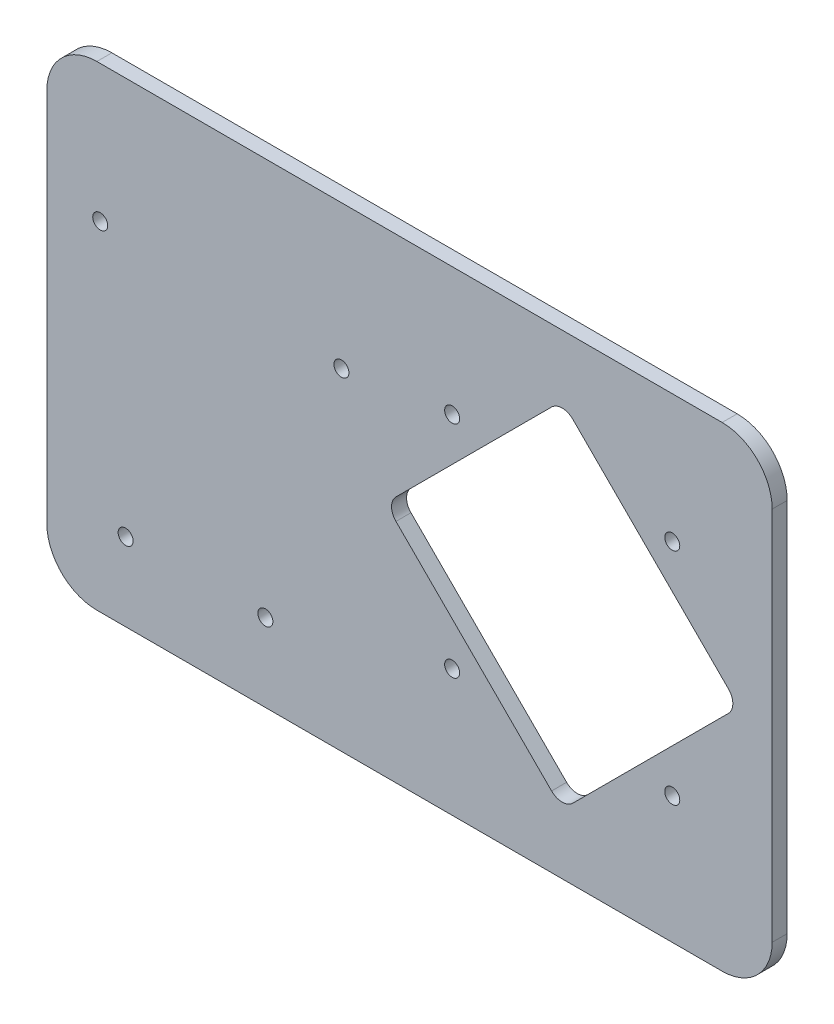
ISO-10303-21;
HEADER;
FILE_DESCRIPTION(('STEP AP214'),'2;1');
FILE_NAME('part.step','',(''),(''),'','','');
FILE_SCHEMA(('AUTOMOTIVE_DESIGN { 1 0 10303 214 1 1 1 1 }'));
ENDSEC;
DATA;
#1=APPLICATION_CONTEXT('core data for automotive mechanical design processes');
#2=APPLICATION_PROTOCOL_DEFINITION('international standard','automotive_design',2000,#1);
#3=PRODUCT_CONTEXT('',#1,'mechanical');
#4=PRODUCT('Part','Part','',(#3));
#5=PRODUCT_RELATED_PRODUCT_CATEGORY('part','',(#4));
#6=PRODUCT_DEFINITION_FORMATION('','',#4);
#7=PRODUCT_DEFINITION_CONTEXT('part definition',#1,'design');
#8=PRODUCT_DEFINITION('design','',#6,#7);
#9=PRODUCT_DEFINITION_SHAPE('','',#8);
#10=(LENGTH_UNIT() NAMED_UNIT(*) SI_UNIT(.MILLI.,.METRE.));
#11=(NAMED_UNIT(*) PLANE_ANGLE_UNIT() SI_UNIT($,.RADIAN.));
#12=(NAMED_UNIT(*) SI_UNIT($,.STERADIAN.) SOLID_ANGLE_UNIT());
#13=UNCERTAINTY_MEASURE_WITH_UNIT(LENGTH_MEASURE(1.E-05),#10,'distance_accuracy_value','');
#14=(GEOMETRIC_REPRESENTATION_CONTEXT(3) GLOBAL_UNCERTAINTY_ASSIGNED_CONTEXT((#13)) GLOBAL_UNIT_ASSIGNED_CONTEXT((#10,
#11,#12)) REPRESENTATION_CONTEXT('',''));
#15=CARTESIAN_POINT('',(0.,0.,0.));
#16=DIRECTION('',(0.,0.,1.));
#17=DIRECTION('',(1.,0.,0.));
#18=AXIS2_PLACEMENT_3D('',#15,#16,#17);
#19=CARTESIAN_POINT('',(210.81212736023,-100.397544227628,3.));
#20=DIRECTION('',(0.,0.,-1.));
#21=DIRECTION('',(-1.,0.,0.));
#22=AXIS2_PLACEMENT_3D('',#19,#20,#21);
#23=PLANE('',#22);
#24=CARTESIAN_POINT('',(119.499920391212,-94.8142449071614,3.));
#25=DIRECTION('',(0.,0.,1.));
#26=DIRECTION('',(1.,0.,0.));
#27=AXIS2_PLACEMENT_3D('',#24,#25,#26);
#28=CIRCLE('',#27,1.5);
#29=CARTESIAN_POINT('',(120.999920391212,-94.8142449071614,3.));
#30=VERTEX_POINT('',#29);
#31=EDGE_CURVE('E389',#30,#30,#28,.T.);
#32=ORIENTED_EDGE('',*,*,#31,.F.);
#33=EDGE_LOOP('',(#32));
#34=FACE_BOUND('',#33,.T.);
#35=CARTESIAN_POINT('',(86.4844395206436,-42.7442449071614,3.));
#36=DIRECTION('',(0.,0.,1.));
#37=DIRECTION('',(1.,0.,0.));
#38=AXIS2_PLACEMENT_3D('',#35,#36,#37);
#39=CIRCLE('',#38,1.5);
#40=CARTESIAN_POINT('',(87.9844395206436,-42.7442449071614,3.));
#41=VERTEX_POINT('',#40);
#42=EDGE_CURVE('E188',#41,#41,#39,.T.);
#43=ORIENTED_EDGE('',*,*,#42,.F.);
#44=EDGE_LOOP('',(#43));
#45=FACE_BOUND('',#44,.T.);
#46=CARTESIAN_POINT('',(200.841254595853,-85.0080740411857,3.));
#47=DIRECTION('',(0.,0.,1.));
#48=DIRECTION('',(1.,0.,0.));
#49=AXIS2_PLACEMENT_3D('',#46,#47,#48);
#50=CIRCLE('',#49,1.49999999999949);
#51=CARTESIAN_POINT('',(202.341254595852,-85.0080740411857,3.));
#52=VERTEX_POINT('',#51);
#53=EDGE_CURVE('E218',#52,#52,#50,.T.);
#54=ORIENTED_EDGE('',*,*,#53,.F.);
#55=EDGE_LOOP('',(#54));
#56=FACE_BOUND('',#55,.T.);
#57=CARTESIAN_POINT('',(156.837999602614,-41.004819047947,3.));
#58=DIRECTION('',(0.,0.,1.));
#59=DIRECTION('',(1.,0.,0.));
#60=AXIS2_PLACEMENT_3D('',#57,#58,#59);
#61=CIRCLE('',#60,1.49999999999937);
#62=CARTESIAN_POINT('',(158.337999602613,-41.004819047947,3.));
#63=VERTEX_POINT('',#62);
#64=EDGE_CURVE('E230',#63,#63,#61,.T.);
#65=ORIENTED_EDGE('',*,*,#64,.F.);
#66=EDGE_LOOP('',(#65));
#67=FACE_BOUND('',#66,.T.);
#68=CARTESIAN_POINT('',(210.81212736023,-100.397544227628,3.));
#69=DIRECTION('',(0.,0.,1.));
#70=DIRECTION('',(-1.,0.,0.));
#71=AXIS2_PLACEMENT_3D('',#68,#69,#70);
#72=CIRCLE('',#71,9.99999999999999);
#73=CARTESIAN_POINT('',(210.81212736023,-110.397544227628,3.));
#74=VERTEX_POINT('',#73);
#75=CARTESIAN_POINT('',(220.81212736023,-100.397544227628,3.));
#76=VERTEX_POINT('',#75);
#77=EDGE_CURVE('E242',#74,#76,#72,.T.);
#78=ORIENTED_EDGE('',*,*,#77,.T.);
#79=DIRECTION('',(0.,1.,0.));
#80=VECTOR('',#79,1.);
#81=CARTESIAN_POINT('',(220.81212736023,-25.3975442276282,3.));
#82=LINE('',#81,#80);
#83=CARTESIAN_POINT('',(220.81212736023,-25.3975442276282,3.));
#84=VERTEX_POINT('',#83);
#85=EDGE_CURVE('E245',#76,#84,#82,.T.);
#86=ORIENTED_EDGE('',*,*,#85,.T.);
#87=CARTESIAN_POINT('',(210.81212736023,-25.3975442276282,3.));
#88=DIRECTION('',(0.,0.,1.));
#89=DIRECTION('',(-1.,0.,0.));
#90=AXIS2_PLACEMENT_3D('',#87,#88,#89);
#91=CIRCLE('',#90,10.);
#92=CARTESIAN_POINT('',(210.81212736023,-15.3975442276282,3.));
#93=VERTEX_POINT('',#92);
#94=EDGE_CURVE('E248',#84,#93,#91,.T.);
#95=ORIENTED_EDGE('',*,*,#94,.T.);
#96=DIRECTION('',(-1.,0.,0.));
#97=VECTOR('',#96,1.);
#98=CARTESIAN_POINT('',(210.81212736023,-15.3975442276282,3.));
#99=LINE('',#98,#97);
#100=CARTESIAN_POINT('',(85.8121273602302,-15.3975442276282,3.));
#101=VERTEX_POINT('',#100);
#102=EDGE_CURVE('E250',#93,#101,#99,.T.);
#103=ORIENTED_EDGE('',*,*,#102,.T.);
#104=CARTESIAN_POINT('',(85.8121273602302,-25.3975442276282,3.));
#105=DIRECTION('',(0.,0.,1.));
#106=DIRECTION('',(1.,0.,0.));
#107=AXIS2_PLACEMENT_3D('',#104,#105,#106);
#108=CIRCLE('',#107,10.);
#109=CARTESIAN_POINT('',(75.8121273602302,-25.3975442276282,3.));
#110=VERTEX_POINT('',#109);
#111=EDGE_CURVE('E252',#101,#110,#108,.T.);
#112=ORIENTED_EDGE('',*,*,#111,.T.);
#113=DIRECTION('',(0.,-1.,0.));
#114=VECTOR('',#113,1.);
#115=CARTESIAN_POINT('',(75.8121273602302,-25.3975442276282,3.));
#116=LINE('',#115,#114);
#117=CARTESIAN_POINT('',(75.8121273602302,-100.397544227628,3.));
#118=VERTEX_POINT('',#117);
#119=EDGE_CURVE('E254',#110,#118,#116,.T.);
#120=ORIENTED_EDGE('',*,*,#119,.T.);
#121=CARTESIAN_POINT('',(85.8121273602302,-100.397544227628,3.));
#122=DIRECTION('',(0.,0.,1.));
#123=DIRECTION('',(-1.,0.,0.));
#124=AXIS2_PLACEMENT_3D('',#121,#122,#123);
#125=CIRCLE('',#124,9.99999999999999);
#126=CARTESIAN_POINT('',(85.8121273602302,-110.397544227628,3.));
#127=VERTEX_POINT('',#126);
#128=EDGE_CURVE('E256',#118,#127,#125,.T.);
#129=ORIENTED_EDGE('',*,*,#128,.T.);
#130=DIRECTION('',(1.,0.,0.));
#131=VECTOR('',#130,1.);
#132=CARTESIAN_POINT('',(210.81212736023,-110.397544227628,3.));
#133=LINE('',#132,#131);
#134=EDGE_CURVE('E258',#127,#74,#133,.T.);
#135=ORIENTED_EDGE('',*,*,#134,.T.);
#136=EDGE_LOOP('',(#78,#86,#95,#103,#112,#120,#129,#135));
#137=FACE_BOUND('',#136,.T.);
#138=CARTESIAN_POINT('',(156.837999602614,-85.0080740411858,3.));
#139=DIRECTION('',(0.,0.,1.));
#140=DIRECTION('',(1.,0.,0.));
#141=AXIS2_PLACEMENT_3D('',#138,#139,#140);
#142=CIRCLE('',#141,1.49999999999944);
#143=CARTESIAN_POINT('',(158.337999602613,-85.0080740411858,3.));
#144=VERTEX_POINT('',#143);
#145=EDGE_CURVE('E236',#144,#144,#142,.T.);
#146=ORIENTED_EDGE('',*,*,#145,.F.);
#147=EDGE_LOOP('',(#146));
#148=FACE_BOUND('',#147,.T.);
#149=CARTESIAN_POINT('',(200.841254595853,-41.0048190479468,3.));
#150=DIRECTION('',(0.,0.,1.));
#151=DIRECTION('',(1.,0.,0.));
#152=AXIS2_PLACEMENT_3D('',#149,#150,#151);
#153=CIRCLE('',#152,1.49999999999958);
#154=CARTESIAN_POINT('',(202.341254595852,-41.0048190479468,3.));
#155=VERTEX_POINT('',#154);
#156=EDGE_CURVE('E224',#155,#155,#153,.T.);
#157=ORIENTED_EDGE('',*,*,#156,.F.);
#158=EDGE_LOOP('',(#157));
#159=FACE_BOUND('',#158,.T.);
#160=CARTESIAN_POINT('',(178.839627099233,-94.1191449167744,3.));
#161=DIRECTION('',(0.,0.,1.));
#162=DIRECTION('',(-1.,0.,0.));
#163=AXIS2_PLACEMENT_3D('',#160,#161,#162);
#164=CIRCLE('',#163,2.99999999999999);
#165=CARTESIAN_POINT('',(176.718306755674,-96.240465260334,3.));
#166=VERTEX_POINT('',#165);
#167=CARTESIAN_POINT('',(180.960947442793,-96.240465260334,3.));
#168=VERTEX_POINT('',#167);
#169=EDGE_CURVE('E150',#166,#168,#164,.T.);
#170=ORIENTED_EDGE('',*,*,#169,.F.);
#171=DIRECTION('',(0.70710678118655,-0.707106781186545,0.));
#172=VECTOR('',#171,1.);
#173=CARTESIAN_POINT('',(176.718306755674,-96.240465260334,3.));
#174=LINE('',#173,#172);
#175=CARTESIAN_POINT('',(145.605608383465,-65.127766888126,3.));
#176=VERTEX_POINT('',#175);
#177=EDGE_CURVE('E185',#176,#166,#174,.T.);
#178=ORIENTED_EDGE('',*,*,#177,.F.);
#179=CARTESIAN_POINT('',(147.726928727025,-63.0064465445664,3.));
#180=DIRECTION('',(0.,0.,1.));
#181=DIRECTION('',(-1.,0.,0.));
#182=AXIS2_PLACEMENT_3D('',#179,#180,#181);
#183=CIRCLE('',#182,3.);
#184=CARTESIAN_POINT('',(145.605608383465,-60.8851262010067,3.));
#185=VERTEX_POINT('',#184);
#186=EDGE_CURVE('E183',#185,#176,#183,.T.);
#187=ORIENTED_EDGE('',*,*,#186,.F.);
#188=DIRECTION('',(-0.707106781186546,-0.707106781186549,0.));
#189=VECTOR('',#188,1.);
#190=CARTESIAN_POINT('',(145.605608383465,-60.8851262010067,3.));
#191=LINE('',#190,#189);
#192=CARTESIAN_POINT('',(176.718306755673,-29.7724278287986,3.));
#193=VERTEX_POINT('',#192);
#194=EDGE_CURVE('E181',#193,#185,#191,.T.);
#195=ORIENTED_EDGE('',*,*,#194,.F.);
#196=CARTESIAN_POINT('',(178.839627099233,-31.8937481723582,3.));
#197=DIRECTION('',(0.,0.,1.));
#198=DIRECTION('',(1.,0.,0.));
#199=AXIS2_PLACEMENT_3D('',#196,#197,#198);
#200=CIRCLE('',#199,2.99999999999999);
#201=CARTESIAN_POINT('',(180.960947442793,-29.7724278287986,3.));
#202=VERTEX_POINT('',#201);
#203=EDGE_CURVE('E179',#202,#193,#200,.T.);
#204=ORIENTED_EDGE('',*,*,#203,.F.);
#205=DIRECTION('',(-0.707106781186549,0.707106781186546,0.));
#206=VECTOR('',#205,1.);
#207=CARTESIAN_POINT('',(180.960947442793,-29.7724278287986,3.));
#208=LINE('',#207,#206);
#209=CARTESIAN_POINT('',(212.073645815001,-60.8851262010066,3.));
#210=VERTEX_POINT('',#209);
#211=EDGE_CURVE('E174',#210,#202,#208,.T.);
#212=ORIENTED_EDGE('',*,*,#211,.F.);
#213=CARTESIAN_POINT('',(209.952325471441,-63.0064465445662,3.));
#214=DIRECTION('',(0.,0.,1.));
#215=DIRECTION('',(-1.,0.,0.));
#216=AXIS2_PLACEMENT_3D('',#213,#214,#215);
#217=CIRCLE('',#216,2.99999999999999);
#218=CARTESIAN_POINT('',(212.073645815001,-65.1277668881258,3.));
#219=VERTEX_POINT('',#218);
#220=EDGE_CURVE('E172',#219,#210,#217,.T.);
#221=ORIENTED_EDGE('',*,*,#220,.F.);
#222=DIRECTION('',(0.707106781186546,0.70710678118655,0.));
#223=VECTOR('',#222,1.);
#224=CARTESIAN_POINT('',(212.073645815001,-65.1277668881258,3.));
#225=LINE('',#224,#223);
#226=EDGE_CURVE('E158',#168,#219,#225,.T.);
#227=ORIENTED_EDGE('',*,*,#226,.F.);
#228=EDGE_LOOP('',(#170,#178,#187,#195,#204,#212,#221,#227));
#229=FACE_BOUND('',#228,.T.);
#230=CARTESIAN_POINT('',(134.704025572101,-44.1136206338699,3.));
#231=DIRECTION('',(0.,0.,1.));
#232=DIRECTION('',(1.,0.,0.));
#233=AXIS2_PLACEMENT_3D('',#230,#231,#232);
#234=CIRCLE('',#233,1.5);
#235=CARTESIAN_POINT('',(136.204025572101,-44.1136206338699,3.));
#236=VERTEX_POINT('',#235);
#237=EDGE_CURVE('E394',#236,#236,#234,.T.);
#238=ORIENTED_EDGE('',*,*,#237,.F.);
#239=EDGE_LOOP('',(#238));
#240=FACE_BOUND('',#239,.T.);
#241=CARTESIAN_POINT('',(91.5644395206436,-94.8142449071614,3.));
#242=DIRECTION('',(0.,0.,1.));
#243=DIRECTION('',(1.,0.,0.));
#244=AXIS2_PLACEMENT_3D('',#241,#242,#243);
#245=CIRCLE('',#244,1.5);
#246=CARTESIAN_POINT('',(93.0644395206436,-94.8142449071614,3.));
#247=VERTEX_POINT('',#246);
#248=EDGE_CURVE('E383',#247,#247,#245,.T.);
#249=ORIENTED_EDGE('',*,*,#248,.F.);
#250=EDGE_LOOP('',(#249));
#251=FACE_BOUND('',#250,.T.);
#252=ADVANCED_FACE('F37',(#34,#45,#56,#67,#137,#148,#159,#229,#240,#251),#23,.F.);
#253=CARTESIAN_POINT('',(210.81212736023,-100.397544227628,0.));
#254=DIRECTION('',(0.,0.,-1.));
#255=DIRECTION('',(-1.,0.,0.));
#256=AXIS2_PLACEMENT_3D('',#253,#254,#255);
#257=PLANE('',#256);
#258=CARTESIAN_POINT('',(119.499920391212,-94.8142449071614,0.));
#259=DIRECTION('',(0.,0.,1.));
#260=DIRECTION('',(1.,0.,0.));
#261=AXIS2_PLACEMENT_3D('',#258,#259,#260);
#262=CIRCLE('',#261,1.5);
#263=CARTESIAN_POINT('',(120.999920391212,-94.8142449071614,0.));
#264=VERTEX_POINT('',#263);
#265=EDGE_CURVE('E386',#264,#264,#262,.T.);
#266=ORIENTED_EDGE('',*,*,#265,.T.);
#267=EDGE_LOOP('',(#266));
#268=FACE_BOUND('',#267,.T.);
#269=CARTESIAN_POINT('',(86.4844395206436,-42.7442449071614,0.));
#270=DIRECTION('',(0.,0.,1.));
#271=DIRECTION('',(1.,0.,0.));
#272=AXIS2_PLACEMENT_3D('',#269,#270,#271);
#273=CIRCLE('',#272,1.5);
#274=CARTESIAN_POINT('',(87.9844395206436,-42.7442449071614,0.));
#275=VERTEX_POINT('',#274);
#276=EDGE_CURVE('E397',#275,#275,#273,.T.);
#277=ORIENTED_EDGE('',*,*,#276,.T.);
#278=EDGE_LOOP('',(#277));
#279=FACE_BOUND('',#278,.T.);
#280=CARTESIAN_POINT('',(200.841254595853,-85.0080740411857,0.));
#281=DIRECTION('',(0.,0.,1.));
#282=DIRECTION('',(1.,0.,0.));
#283=AXIS2_PLACEMENT_3D('',#280,#281,#282);
#284=CIRCLE('',#283,1.49999999999949);
#285=CARTESIAN_POINT('',(202.341254595852,-85.0080740411857,0.));
#286=VERTEX_POINT('',#285);
#287=EDGE_CURVE('E166',#286,#286,#284,.T.);
#288=ORIENTED_EDGE('',*,*,#287,.T.);
#289=EDGE_LOOP('',(#288));
#290=FACE_BOUND('',#289,.T.);
#291=CARTESIAN_POINT('',(156.837999602614,-41.004819047947,0.));
#292=DIRECTION('',(0.,0.,1.));
#293=DIRECTION('',(1.,0.,0.));
#294=AXIS2_PLACEMENT_3D('',#291,#292,#293);
#295=CIRCLE('',#294,1.49999999999937);
#296=CARTESIAN_POINT('',(158.337999602613,-41.004819047947,0.));
#297=VERTEX_POINT('',#296);
#298=EDGE_CURVE('E227',#297,#297,#295,.T.);
#299=ORIENTED_EDGE('',*,*,#298,.T.);
#300=EDGE_LOOP('',(#299));
#301=FACE_BOUND('',#300,.T.);
#302=CARTESIAN_POINT('',(210.81212736023,-100.397544227628,0.));
#303=DIRECTION('',(0.,0.,1.));
#304=DIRECTION('',(-1.,0.,0.));
#305=AXIS2_PLACEMENT_3D('',#302,#303,#304);
#306=CIRCLE('',#305,9.99999999999999);
#307=CARTESIAN_POINT('',(210.81212736023,-110.397544227628,0.));
#308=VERTEX_POINT('',#307);
#309=CARTESIAN_POINT('',(220.81212736023,-100.397544227628,0.));
#310=VERTEX_POINT('',#309);
#311=EDGE_CURVE('E239',#308,#310,#306,.T.);
#312=ORIENTED_EDGE('',*,*,#311,.F.);
#313=DIRECTION('',(1.,0.,0.));
#314=VECTOR('',#313,1.);
#315=CARTESIAN_POINT('',(210.81212736023,-110.397544227628,0.));
#316=LINE('',#315,#314);
#317=CARTESIAN_POINT('',(85.8121273602302,-110.397544227628,0.));
#318=VERTEX_POINT('',#317);
#319=EDGE_CURVE('E246',#318,#308,#316,.T.);
#320=ORIENTED_EDGE('',*,*,#319,.F.);
#321=CARTESIAN_POINT('',(85.8121273602302,-100.397544227628,0.));
#322=DIRECTION('',(0.,0.,1.));
#323=DIRECTION('',(-1.,0.,0.));
#324=AXIS2_PLACEMENT_3D('',#321,#322,#323);
#325=CIRCLE('',#324,9.99999999999999);
#326=CARTESIAN_POINT('',(75.8121273602302,-100.397544227628,0.));
#327=VERTEX_POINT('',#326);
#328=EDGE_CURVE('E273',#327,#318,#325,.T.);
#329=ORIENTED_EDGE('',*,*,#328,.F.);
#330=DIRECTION('',(0.,-1.,0.));
#331=VECTOR('',#330,1.);
#332=CARTESIAN_POINT('',(75.8121273602302,-25.3975442276282,0.));
#333=LINE('',#332,#331);
#334=CARTESIAN_POINT('',(75.8121273602302,-25.3975442276282,0.));
#335=VERTEX_POINT('',#334);
#336=EDGE_CURVE('E271',#335,#327,#333,.T.);
#337=ORIENTED_EDGE('',*,*,#336,.F.);
#338=CARTESIAN_POINT('',(85.8121273602302,-25.3975442276282,0.));
#339=DIRECTION('',(0.,0.,1.));
#340=DIRECTION('',(1.,0.,0.));
#341=AXIS2_PLACEMENT_3D('',#338,#339,#340);
#342=CIRCLE('',#341,10.);
#343=CARTESIAN_POINT('',(85.8121273602302,-15.3975442276282,0.));
#344=VERTEX_POINT('',#343);
#345=EDGE_CURVE('E269',#344,#335,#342,.T.);
#346=ORIENTED_EDGE('',*,*,#345,.F.);
#347=DIRECTION('',(-1.,0.,0.));
#348=VECTOR('',#347,1.);
#349=CARTESIAN_POINT('',(210.81212736023,-15.3975442276282,0.));
#350=LINE('',#349,#348);
#351=CARTESIAN_POINT('',(210.81212736023,-15.3975442276282,0.));
#352=VERTEX_POINT('',#351);
#353=EDGE_CURVE('E267',#352,#344,#350,.T.);
#354=ORIENTED_EDGE('',*,*,#353,.F.);
#355=CARTESIAN_POINT('',(210.81212736023,-25.3975442276282,0.));
#356=DIRECTION('',(0.,0.,1.));
#357=DIRECTION('',(-1.,0.,0.));
#358=AXIS2_PLACEMENT_3D('',#355,#356,#357);
#359=CIRCLE('',#358,10.);
#360=CARTESIAN_POINT('',(220.81212736023,-25.3975442276282,0.));
#361=VERTEX_POINT('',#360);
#362=EDGE_CURVE('E265',#361,#352,#359,.T.);
#363=ORIENTED_EDGE('',*,*,#362,.F.);
#364=DIRECTION('',(0.,1.,0.));
#365=VECTOR('',#364,1.);
#366=CARTESIAN_POINT('',(220.81212736023,-25.3975442276282,0.));
#367=LINE('',#366,#365);
#368=EDGE_CURVE('E263',#310,#361,#367,.T.);
#369=ORIENTED_EDGE('',*,*,#368,.F.);
#370=EDGE_LOOP('',(#312,#320,#329,#337,#346,#354,#363,#369));
#371=FACE_BOUND('',#370,.T.);
#372=CARTESIAN_POINT('',(156.837999602614,-85.0080740411858,0.));
#373=DIRECTION('',(0.,0.,1.));
#374=DIRECTION('',(1.,0.,0.));
#375=AXIS2_PLACEMENT_3D('',#372,#373,#374);
#376=CIRCLE('',#375,1.49999999999944);
#377=CARTESIAN_POINT('',(158.337999602613,-85.0080740411858,0.));
#378=VERTEX_POINT('',#377);
#379=EDGE_CURVE('E233',#378,#378,#376,.T.);
#380=ORIENTED_EDGE('',*,*,#379,.T.);
#381=EDGE_LOOP('',(#380));
#382=FACE_BOUND('',#381,.T.);
#383=CARTESIAN_POINT('',(200.841254595853,-41.0048190479468,0.));
#384=DIRECTION('',(0.,0.,1.));
#385=DIRECTION('',(1.,0.,0.));
#386=AXIS2_PLACEMENT_3D('',#383,#384,#385);
#387=CIRCLE('',#386,1.49999999999958);
#388=CARTESIAN_POINT('',(202.341254595852,-41.0048190479468,0.));
#389=VERTEX_POINT('',#388);
#390=EDGE_CURVE('E221',#389,#389,#387,.T.);
#391=ORIENTED_EDGE('',*,*,#390,.T.);
#392=EDGE_LOOP('',(#391));
#393=FACE_BOUND('',#392,.T.);
#394=DIRECTION('',(0.70710678118655,-0.707106781186545,0.));
#395=VECTOR('',#394,1.);
#396=CARTESIAN_POINT('',(176.718306755674,-96.240465260334,0.));
#397=LINE('',#396,#395);
#398=CARTESIAN_POINT('',(145.605608383465,-65.127766888126,0.));
#399=VERTEX_POINT('',#398);
#400=CARTESIAN_POINT('',(176.718306755674,-96.240465260334,0.));
#401=VERTEX_POINT('',#400);
#402=EDGE_CURVE('E159',#399,#401,#397,.T.);
#403=ORIENTED_EDGE('',*,*,#402,.T.);
#404=CARTESIAN_POINT('',(178.839627099233,-94.1191449167744,0.));
#405=DIRECTION('',(0.,0.,1.));
#406=DIRECTION('',(-1.,0.,0.));
#407=AXIS2_PLACEMENT_3D('',#404,#405,#406);
#408=CIRCLE('',#407,2.99999999999999);
#409=CARTESIAN_POINT('',(180.960947442793,-96.240465260334,0.));
#410=VERTEX_POINT('',#409);
#411=EDGE_CURVE('E60',#401,#410,#408,.T.);
#412=ORIENTED_EDGE('',*,*,#411,.T.);
#413=DIRECTION('',(0.707106781186546,0.70710678118655,0.));
#414=VECTOR('',#413,1.);
#415=CARTESIAN_POINT('',(212.073645815001,-65.1277668881258,0.));
#416=LINE('',#415,#414);
#417=CARTESIAN_POINT('',(212.073645815001,-65.1277668881258,0.));
#418=VERTEX_POINT('',#417);
#419=EDGE_CURVE('E165',#410,#418,#416,.T.);
#420=ORIENTED_EDGE('',*,*,#419,.T.);
#421=CARTESIAN_POINT('',(209.952325471441,-63.0064465445662,0.));
#422=DIRECTION('',(0.,0.,1.));
#423=DIRECTION('',(-1.,0.,0.));
#424=AXIS2_PLACEMENT_3D('',#421,#422,#423);
#425=CIRCLE('',#424,2.99999999999999);
#426=CARTESIAN_POINT('',(212.073645815001,-60.8851262010066,0.));
#427=VERTEX_POINT('',#426);
#428=EDGE_CURVE('E190',#418,#427,#425,.T.);
#429=ORIENTED_EDGE('',*,*,#428,.T.);
#430=DIRECTION('',(-0.707106781186549,0.707106781186546,0.));
#431=VECTOR('',#430,1.);
#432=CARTESIAN_POINT('',(180.960947442793,-29.7724278287986,0.));
#433=LINE('',#432,#431);
#434=CARTESIAN_POINT('',(180.960947442793,-29.7724278287986,0.));
#435=VERTEX_POINT('',#434);
#436=EDGE_CURVE('E193',#427,#435,#433,.T.);
#437=ORIENTED_EDGE('',*,*,#436,.T.);
#438=CARTESIAN_POINT('',(178.839627099233,-31.8937481723582,0.));
#439=DIRECTION('',(0.,0.,1.));
#440=DIRECTION('',(1.,0.,0.));
#441=AXIS2_PLACEMENT_3D('',#438,#439,#440);
#442=CIRCLE('',#441,2.99999999999999);
#443=CARTESIAN_POINT('',(176.718306755673,-29.7724278287986,0.));
#444=VERTEX_POINT('',#443);
#445=EDGE_CURVE('E196',#435,#444,#442,.T.);
#446=ORIENTED_EDGE('',*,*,#445,.T.);
#447=DIRECTION('',(-0.707106781186546,-0.707106781186549,0.));
#448=VECTOR('',#447,1.);
#449=CARTESIAN_POINT('',(145.605608383465,-60.8851262010067,0.));
#450=LINE('',#449,#448);
#451=CARTESIAN_POINT('',(145.605608383465,-60.8851262010067,0.));
#452=VERTEX_POINT('',#451);
#453=EDGE_CURVE('E199',#444,#452,#450,.T.);
#454=ORIENTED_EDGE('',*,*,#453,.T.);
#455=CARTESIAN_POINT('',(147.726928727025,-63.0064465445664,0.));
#456=DIRECTION('',(0.,0.,1.));
#457=DIRECTION('',(-1.,0.,0.));
#458=AXIS2_PLACEMENT_3D('',#455,#456,#457);
#459=CIRCLE('',#458,3.);
#460=EDGE_CURVE('E202',#452,#399,#459,.T.);
#461=ORIENTED_EDGE('',*,*,#460,.T.);
#462=EDGE_LOOP('',(#403,#412,#420,#429,#437,#446,#454,#461));
#463=FACE_BOUND('',#462,.T.);
#464=CARTESIAN_POINT('',(134.704025572101,-44.1136206338699,0.));
#465=DIRECTION('',(0.,0.,1.));
#466=DIRECTION('',(1.,0.,0.));
#467=AXIS2_PLACEMENT_3D('',#464,#465,#466);
#468=CIRCLE('',#467,1.5);
#469=CARTESIAN_POINT('',(136.204025572101,-44.1136206338699,0.));
#470=VERTEX_POINT('',#469);
#471=EDGE_CURVE('E378',#470,#470,#468,.T.);
#472=ORIENTED_EDGE('',*,*,#471,.T.);
#473=EDGE_LOOP('',(#472));
#474=FACE_BOUND('',#473,.T.);
#475=CARTESIAN_POINT('',(91.5644395206436,-94.8142449071614,0.));
#476=DIRECTION('',(0.,0.,1.));
#477=DIRECTION('',(1.,0.,0.));
#478=AXIS2_PLACEMENT_3D('',#475,#476,#477);
#479=CIRCLE('',#478,1.5);
#480=CARTESIAN_POINT('',(93.0644395206436,-94.8142449071614,0.));
#481=VERTEX_POINT('',#480);
#482=EDGE_CURVE('E381',#481,#481,#479,.T.);
#483=ORIENTED_EDGE('',*,*,#482,.T.);
#484=EDGE_LOOP('',(#483));
#485=FACE_BOUND('',#484,.T.);
#486=ADVANCED_FACE('F303',(#268,#279,#290,#301,#371,#382,#393,#463,#474,#485),#257,.T.);
#487=CARTESIAN_POINT('',(210.81212736023,-100.397544227628,3.));
#488=DIRECTION('',(0.,0.,-1.));
#489=DIRECTION('',(-1.,0.,0.));
#490=AXIS2_PLACEMENT_3D('',#487,#488,#489);
#491=CYLINDRICAL_SURFACE('',#490,9.99999999999999);
#492=ORIENTED_EDGE('',*,*,#311,.T.);
#493=DIRECTION('',(0.,0.,-1.));
#494=VECTOR('',#493,1.);
#495=CARTESIAN_POINT('',(220.81212736023,-100.397544227628,3.));
#496=LINE('',#495,#494);
#497=EDGE_CURVE('E11',#76,#310,#496,.T.);
#498=ORIENTED_EDGE('',*,*,#497,.F.);
#499=ORIENTED_EDGE('',*,*,#77,.F.);
#500=DIRECTION('',(0.,0.,-1.));
#501=VECTOR('',#500,1.);
#502=CARTESIAN_POINT('',(210.81212736023,-110.397544227628,3.));
#503=LINE('',#502,#501);
#504=EDGE_CURVE('E260',#74,#308,#503,.T.);
#505=ORIENTED_EDGE('',*,*,#504,.T.);
#506=EDGE_LOOP('',(#492,#498,#499,#505));
#507=FACE_BOUND('',#506,.T.);
#508=ADVANCED_FACE('F39',(#507),#491,.T.);
#509=CARTESIAN_POINT('',(220.81212736023,-25.3975442276282,3.));
#510=DIRECTION('',(-1.,0.,0.));
#511=DIRECTION('',(0.,-1.,0.));
#512=AXIS2_PLACEMENT_3D('',#509,#510,#511);
#513=PLANE('',#512);
#514=ORIENTED_EDGE('',*,*,#368,.T.);
#515=DIRECTION('',(0.,0.,-1.));
#516=VECTOR('',#515,1.);
#517=CARTESIAN_POINT('',(220.81212736023,-25.3975442276282,3.));
#518=LINE('',#517,#516);
#519=EDGE_CURVE('E45',#84,#361,#518,.T.);
#520=ORIENTED_EDGE('',*,*,#519,.F.);
#521=ORIENTED_EDGE('',*,*,#85,.F.);
#522=ORIENTED_EDGE('',*,*,#497,.T.);
#523=EDGE_LOOP('',(#514,#520,#521,#522));
#524=FACE_BOUND('',#523,.T.);
#525=ADVANCED_FACE('F321',(#524),#513,.F.);
#526=CARTESIAN_POINT('',(210.81212736023,-25.3975442276282,3.));
#527=DIRECTION('',(0.,0.,-1.));
#528=DIRECTION('',(-1.,0.,0.));
#529=AXIS2_PLACEMENT_3D('',#526,#527,#528);
#530=CYLINDRICAL_SURFACE('',#529,10.);
#531=ORIENTED_EDGE('',*,*,#362,.T.);
#532=DIRECTION('',(0.,0.,-1.));
#533=VECTOR('',#532,1.);
#534=CARTESIAN_POINT('',(210.81212736023,-15.3975442276282,3.));
#535=LINE('',#534,#533);
#536=EDGE_CURVE('E290',#93,#352,#535,.T.);
#537=ORIENTED_EDGE('',*,*,#536,.F.);
#538=ORIENTED_EDGE('',*,*,#94,.F.);
#539=ORIENTED_EDGE('',*,*,#519,.T.);
#540=EDGE_LOOP('',(#531,#537,#538,#539));
#541=FACE_BOUND('',#540,.T.);
#542=ADVANCED_FACE('F297',(#541),#530,.T.);
#543=CARTESIAN_POINT('',(210.81212736023,-15.3975442276282,3.));
#544=DIRECTION('',(0.,-1.,0.));
#545=DIRECTION('',(1.,0.,0.));
#546=AXIS2_PLACEMENT_3D('',#543,#544,#545);
#547=PLANE('',#546);
#548=ORIENTED_EDGE('',*,*,#353,.T.);
#549=DIRECTION('',(0.,0.,-1.));
#550=VECTOR('',#549,1.);
#551=CARTESIAN_POINT('',(85.8121273602302,-15.3975442276282,3.));
#552=LINE('',#551,#550);
#553=EDGE_CURVE('E287',#101,#344,#552,.T.);
#554=ORIENTED_EDGE('',*,*,#553,.F.);
#555=ORIENTED_EDGE('',*,*,#102,.F.);
#556=ORIENTED_EDGE('',*,*,#536,.T.);
#557=EDGE_LOOP('',(#548,#554,#555,#556));
#558=FACE_BOUND('',#557,.T.);
#559=ADVANCED_FACE('F309',(#558),#547,.F.);
#560=CARTESIAN_POINT('',(85.8121273602302,-25.3975442276282,3.));
#561=DIRECTION('',(0.,0.,-1.));
#562=DIRECTION('',(-1.,0.,0.));
#563=AXIS2_PLACEMENT_3D('',#560,#561,#562);
#564=CYLINDRICAL_SURFACE('',#563,10.);
#565=ORIENTED_EDGE('',*,*,#345,.T.);
#566=DIRECTION('',(0.,0.,-1.));
#567=VECTOR('',#566,1.);
#568=CARTESIAN_POINT('',(75.8121273602302,-25.3975442276282,3.));
#569=LINE('',#568,#567);
#570=EDGE_CURVE('E284',#110,#335,#569,.T.);
#571=ORIENTED_EDGE('',*,*,#570,.F.);
#572=ORIENTED_EDGE('',*,*,#111,.F.);
#573=ORIENTED_EDGE('',*,*,#553,.T.);
#574=EDGE_LOOP('',(#565,#571,#572,#573));
#575=FACE_BOUND('',#574,.T.);
#576=ADVANCED_FACE('F313',(#575),#564,.T.);
#577=CARTESIAN_POINT('',(75.8121273602302,-25.3975442276282,3.));
#578=DIRECTION('',(1.,0.,0.));
#579=DIRECTION('',(0.,0.,-1.));
#580=AXIS2_PLACEMENT_3D('',#577,#578,#579);
#581=PLANE('',#580);
#582=ORIENTED_EDGE('',*,*,#336,.T.);
#583=DIRECTION('',(0.,0.,-1.));
#584=VECTOR('',#583,1.);
#585=CARTESIAN_POINT('',(75.8121273602302,-100.397544227628,3.));
#586=LINE('',#585,#584);
#587=EDGE_CURVE('E281',#118,#327,#586,.T.);
#588=ORIENTED_EDGE('',*,*,#587,.F.);
#589=ORIENTED_EDGE('',*,*,#119,.F.);
#590=ORIENTED_EDGE('',*,*,#570,.T.);
#591=EDGE_LOOP('',(#582,#588,#589,#590));
#592=FACE_BOUND('',#591,.T.);
#593=ADVANCED_FACE('F334',(#592),#581,.F.);
#594=CARTESIAN_POINT('',(85.8121273602302,-100.397544227628,3.));
#595=DIRECTION('',(0.,0.,-1.));
#596=DIRECTION('',(-1.,0.,0.));
#597=AXIS2_PLACEMENT_3D('',#594,#595,#596);
#598=CYLINDRICAL_SURFACE('',#597,9.99999999999999);
#599=ORIENTED_EDGE('',*,*,#328,.T.);
#600=DIRECTION('',(0.,0.,-1.));
#601=VECTOR('',#600,1.);
#602=CARTESIAN_POINT('',(85.8121273602302,-110.397544227628,3.));
#603=LINE('',#602,#601);
#604=EDGE_CURVE('E278',#127,#318,#603,.T.);
#605=ORIENTED_EDGE('',*,*,#604,.F.);
#606=ORIENTED_EDGE('',*,*,#128,.F.);
#607=ORIENTED_EDGE('',*,*,#587,.T.);
#608=EDGE_LOOP('',(#599,#605,#606,#607));
#609=FACE_BOUND('',#608,.T.);
#610=ADVANCED_FACE('F332',(#609),#598,.T.);
#611=CARTESIAN_POINT('',(210.81212736023,-110.397544227628,3.));
#612=DIRECTION('',(0.,1.,0.));
#613=DIRECTION('',(-1.,0.,0.));
#614=AXIS2_PLACEMENT_3D('',#611,#612,#613);
#615=PLANE('',#614);
#616=ORIENTED_EDGE('',*,*,#319,.T.);
#617=ORIENTED_EDGE('',*,*,#504,.F.);
#618=ORIENTED_EDGE('',*,*,#134,.F.);
#619=ORIENTED_EDGE('',*,*,#604,.T.);
#620=EDGE_LOOP('',(#616,#617,#618,#619));
#621=FACE_BOUND('',#620,.T.);
#622=ADVANCED_FACE('F327',(#621),#615,.F.);
#623=CARTESIAN_POINT('',(156.837999602614,-85.0080740411858,3.));
#624=DIRECTION('',(0.,0.,-1.));
#625=DIRECTION('',(-1.,0.,0.));
#626=AXIS2_PLACEMENT_3D('',#623,#624,#625);
#627=CYLINDRICAL_SURFACE('',#626,1.49999999999944);
#628=ORIENTED_EDGE('',*,*,#145,.T.);
#629=EDGE_LOOP('',(#628));
#630=FACE_BOUND('',#629,.T.);
#631=ORIENTED_EDGE('',*,*,#379,.F.);
#632=EDGE_LOOP('',(#631));
#633=FACE_BOUND('',#632,.T.);
#634=ADVANCED_FACE('F354',(#630,#633),#627,.F.);
#635=CARTESIAN_POINT('',(156.837999602614,-41.004819047947,3.));
#636=DIRECTION('',(0.,0.,-1.));
#637=DIRECTION('',(-1.,0.,0.));
#638=AXIS2_PLACEMENT_3D('',#635,#636,#637);
#639=CYLINDRICAL_SURFACE('',#638,1.49999999999937);
#640=ORIENTED_EDGE('',*,*,#64,.T.);
#641=EDGE_LOOP('',(#640));
#642=FACE_BOUND('',#641,.T.);
#643=ORIENTED_EDGE('',*,*,#298,.F.);
#644=EDGE_LOOP('',(#643));
#645=FACE_BOUND('',#644,.T.);
#646=ADVANCED_FACE('F361',(#642,#645),#639,.F.);
#647=CARTESIAN_POINT('',(200.841254595853,-41.0048190479468,3.));
#648=DIRECTION('',(0.,0.,-1.));
#649=DIRECTION('',(-1.,0.,0.));
#650=AXIS2_PLACEMENT_3D('',#647,#648,#649);
#651=CYLINDRICAL_SURFACE('',#650,1.49999999999958);
#652=ORIENTED_EDGE('',*,*,#156,.T.);
#653=EDGE_LOOP('',(#652));
#654=FACE_BOUND('',#653,.T.);
#655=ORIENTED_EDGE('',*,*,#390,.F.);
#656=EDGE_LOOP('',(#655));
#657=FACE_BOUND('',#656,.T.);
#658=ADVANCED_FACE('F366',(#654,#657),#651,.F.);
#659=CARTESIAN_POINT('',(200.841254595853,-85.0080740411857,3.));
#660=DIRECTION('',(0.,0.,-1.));
#661=DIRECTION('',(-1.,0.,0.));
#662=AXIS2_PLACEMENT_3D('',#659,#660,#661);
#663=CYLINDRICAL_SURFACE('',#662,1.49999999999949);
#664=ORIENTED_EDGE('',*,*,#53,.T.);
#665=EDGE_LOOP('',(#664));
#666=FACE_BOUND('',#665,.T.);
#667=ORIENTED_EDGE('',*,*,#287,.F.);
#668=EDGE_LOOP('',(#667));
#669=FACE_BOUND('',#668,.T.);
#670=ADVANCED_FACE('F445',(#666,#669),#663,.F.);
#671=CARTESIAN_POINT('',(178.839627099233,-94.1191449167744,3.));
#672=DIRECTION('',(0.,0.,-1.));
#673=DIRECTION('',(-1.,0.,0.));
#674=AXIS2_PLACEMENT_3D('',#671,#672,#673);
#675=CYLINDRICAL_SURFACE('',#674,2.99999999999999);
#676=ORIENTED_EDGE('',*,*,#411,.F.);
#677=DIRECTION('',(0.,0.,-1.));
#678=VECTOR('',#677,1.);
#679=CARTESIAN_POINT('',(176.718306755674,-96.240465260334,3.));
#680=LINE('',#679,#678);
#681=EDGE_CURVE('E154',#166,#401,#680,.T.);
#682=ORIENTED_EDGE('',*,*,#681,.F.);
#683=ORIENTED_EDGE('',*,*,#169,.T.);
#684=DIRECTION('',(0.,0.,-1.));
#685=VECTOR('',#684,1.);
#686=CARTESIAN_POINT('',(180.960947442793,-96.240465260334,3.));
#687=LINE('',#686,#685);
#688=EDGE_CURVE('E153',#168,#410,#687,.T.);
#689=ORIENTED_EDGE('',*,*,#688,.T.);
#690=EDGE_LOOP('',(#676,#682,#683,#689));
#691=FACE_BOUND('',#690,.T.);
#692=ADVANCED_FACE('F152',(#691),#675,.F.);
#693=CARTESIAN_POINT('',(212.073645815001,-65.1277668881258,3.));
#694=DIRECTION('',(-0.707106781186549,0.707106781186545,0.));
#695=DIRECTION('',(-0.707106781186546,-0.70710678118655,0.));
#696=AXIS2_PLACEMENT_3D('',#693,#694,#695);
#697=PLANE('',#696);
#698=ORIENTED_EDGE('',*,*,#419,.F.);
#699=ORIENTED_EDGE('',*,*,#688,.F.);
#700=ORIENTED_EDGE('',*,*,#226,.T.);
#701=DIRECTION('',(0.,0.,-1.));
#702=VECTOR('',#701,1.);
#703=CARTESIAN_POINT('',(212.073645815001,-65.1277668881258,3.));
#704=LINE('',#703,#702);
#705=EDGE_CURVE('E167',#219,#418,#704,.T.);
#706=ORIENTED_EDGE('',*,*,#705,.T.);
#707=EDGE_LOOP('',(#698,#699,#700,#706));
#708=FACE_BOUND('',#707,.T.);
#709=ADVANCED_FACE('F162',(#708),#697,.T.);
#710=CARTESIAN_POINT('',(209.952325471441,-63.0064465445662,3.));
#711=DIRECTION('',(0.,0.,-1.));
#712=DIRECTION('',(-1.,0.,0.));
#713=AXIS2_PLACEMENT_3D('',#710,#711,#712);
#714=CYLINDRICAL_SURFACE('',#713,2.99999999999999);
#715=ORIENTED_EDGE('',*,*,#428,.F.);
#716=ORIENTED_EDGE('',*,*,#705,.F.);
#717=ORIENTED_EDGE('',*,*,#220,.T.);
#718=DIRECTION('',(0.,0.,-1.));
#719=VECTOR('',#718,1.);
#720=CARTESIAN_POINT('',(212.073645815001,-60.8851262010066,3.));
#721=LINE('',#720,#719);
#722=EDGE_CURVE('E215',#210,#427,#721,.T.);
#723=ORIENTED_EDGE('',*,*,#722,.T.);
#724=EDGE_LOOP('',(#715,#716,#717,#723));
#725=FACE_BOUND('',#724,.T.);
#726=ADVANCED_FACE('F436',(#725),#714,.F.);
#727=CARTESIAN_POINT('',(180.960947442793,-29.7724278287986,3.));
#728=DIRECTION('',(-0.707106781186546,-0.707106781186549,0.));
#729=DIRECTION('',(0.707106781186549,-0.707106781186546,0.));
#730=AXIS2_PLACEMENT_3D('',#727,#728,#729);
#731=PLANE('',#730);
#732=ORIENTED_EDGE('',*,*,#436,.F.);
#733=ORIENTED_EDGE('',*,*,#722,.F.);
#734=ORIENTED_EDGE('',*,*,#211,.T.);
#735=DIRECTION('',(0.,0.,-1.));
#736=VECTOR('',#735,1.);
#737=CARTESIAN_POINT('',(180.960947442793,-29.7724278287986,3.));
#738=LINE('',#737,#736);
#739=EDGE_CURVE('E213',#202,#435,#738,.T.);
#740=ORIENTED_EDGE('',*,*,#739,.T.);
#741=EDGE_LOOP('',(#732,#733,#734,#740));
#742=FACE_BOUND('',#741,.T.);
#743=ADVANCED_FACE('F432',(#742),#731,.T.);
#744=CARTESIAN_POINT('',(178.839627099233,-31.8937481723582,3.));
#745=DIRECTION('',(0.,0.,-1.));
#746=DIRECTION('',(-1.,0.,0.));
#747=AXIS2_PLACEMENT_3D('',#744,#745,#746);
#748=CYLINDRICAL_SURFACE('',#747,2.99999999999999);
#749=ORIENTED_EDGE('',*,*,#445,.F.);
#750=ORIENTED_EDGE('',*,*,#739,.F.);
#751=ORIENTED_EDGE('',*,*,#203,.T.);
#752=DIRECTION('',(0.,0.,-1.));
#753=VECTOR('',#752,1.);
#754=CARTESIAN_POINT('',(176.718306755673,-29.7724278287986,3.));
#755=LINE('',#754,#753);
#756=EDGE_CURVE('E211',#193,#444,#755,.T.);
#757=ORIENTED_EDGE('',*,*,#756,.T.);
#758=EDGE_LOOP('',(#749,#750,#751,#757));
#759=FACE_BOUND('',#758,.T.);
#760=ADVANCED_FACE('F428',(#759),#748,.F.);
#761=CARTESIAN_POINT('',(145.605608383465,-60.8851262010067,3.));
#762=DIRECTION('',(0.707106781186549,-0.707106781186546,0.));
#763=DIRECTION('',(0.707106781186546,0.707106781186549,0.));
#764=AXIS2_PLACEMENT_3D('',#761,#762,#763);
#765=PLANE('',#764);
#766=ORIENTED_EDGE('',*,*,#453,.F.);
#767=ORIENTED_EDGE('',*,*,#756,.F.);
#768=ORIENTED_EDGE('',*,*,#194,.T.);
#769=DIRECTION('',(0.,0.,-1.));
#770=VECTOR('',#769,1.);
#771=CARTESIAN_POINT('',(145.605608383465,-60.8851262010067,3.));
#772=LINE('',#771,#770);
#773=EDGE_CURVE('E209',#185,#452,#772,.T.);
#774=ORIENTED_EDGE('',*,*,#773,.T.);
#775=EDGE_LOOP('',(#766,#767,#768,#774));
#776=FACE_BOUND('',#775,.T.);
#777=ADVANCED_FACE('F424',(#776),#765,.T.);
#778=CARTESIAN_POINT('',(147.726928727025,-63.0064465445664,3.));
#779=DIRECTION('',(0.,0.,-1.));
#780=DIRECTION('',(-1.,0.,0.));
#781=AXIS2_PLACEMENT_3D('',#778,#779,#780);
#782=CYLINDRICAL_SURFACE('',#781,3.);
#783=ORIENTED_EDGE('',*,*,#460,.F.);
#784=ORIENTED_EDGE('',*,*,#773,.F.);
#785=ORIENTED_EDGE('',*,*,#186,.T.);
#786=DIRECTION('',(0.,0.,-1.));
#787=VECTOR('',#786,1.);
#788=CARTESIAN_POINT('',(145.605608383465,-65.127766888126,3.));
#789=LINE('',#788,#787);
#790=EDGE_CURVE('E52',#176,#399,#789,.T.);
#791=ORIENTED_EDGE('',*,*,#790,.T.);
#792=EDGE_LOOP('',(#783,#784,#785,#791));
#793=FACE_BOUND('',#792,.T.);
#794=ADVANCED_FACE('F418',(#793),#782,.F.);
#795=CARTESIAN_POINT('',(176.718306755674,-96.240465260334,3.));
#796=DIRECTION('',(0.707106781186545,0.70710678118655,0.));
#797=DIRECTION('',(-0.70710678118655,0.707106781186545,0.));
#798=AXIS2_PLACEMENT_3D('',#795,#796,#797);
#799=PLANE('',#798);
#800=ORIENTED_EDGE('',*,*,#402,.F.);
#801=ORIENTED_EDGE('',*,*,#790,.F.);
#802=ORIENTED_EDGE('',*,*,#177,.T.);
#803=ORIENTED_EDGE('',*,*,#681,.T.);
#804=EDGE_LOOP('',(#800,#801,#802,#803));
#805=FACE_BOUND('',#804,.T.);
#806=ADVANCED_FACE('F408',(#805),#799,.T.);
#807=CARTESIAN_POINT('',(86.4844395206436,-42.7442449071614,3.));
#808=DIRECTION('',(0.,0.,-1.));
#809=DIRECTION('',(-1.,0.,0.));
#810=AXIS2_PLACEMENT_3D('',#807,#808,#809);
#811=CYLINDRICAL_SURFACE('',#810,1.5);
#812=ORIENTED_EDGE('',*,*,#42,.T.);
#813=EDGE_LOOP('',(#812));
#814=FACE_BOUND('',#813,.T.);
#815=ORIENTED_EDGE('',*,*,#276,.F.);
#816=EDGE_LOOP('',(#815));
#817=FACE_BOUND('',#816,.T.);
#818=ADVANCED_FACE('F405',(#814,#817),#811,.F.);
#819=CARTESIAN_POINT('',(134.704025572101,-44.1136206338699,3.));
#820=DIRECTION('',(0.,0.,-1.));
#821=DIRECTION('',(-1.,0.,0.));
#822=AXIS2_PLACEMENT_3D('',#819,#820,#821);
#823=CYLINDRICAL_SURFACE('',#822,1.5);
#824=ORIENTED_EDGE('',*,*,#237,.T.);
#825=EDGE_LOOP('',(#824));
#826=FACE_BOUND('',#825,.T.);
#827=ORIENTED_EDGE('',*,*,#471,.F.);
#828=EDGE_LOOP('',(#827));
#829=FACE_BOUND('',#828,.T.);
#830=ADVANCED_FACE('F407',(#826,#829),#823,.F.);
#831=CARTESIAN_POINT('',(119.499920391212,-94.8142449071614,3.));
#832=DIRECTION('',(0.,0.,-1.));
#833=DIRECTION('',(-1.,0.,0.));
#834=AXIS2_PLACEMENT_3D('',#831,#832,#833);
#835=CYLINDRICAL_SURFACE('',#834,1.5);
#836=ORIENTED_EDGE('',*,*,#31,.T.);
#837=EDGE_LOOP('',(#836));
#838=FACE_BOUND('',#837,.T.);
#839=ORIENTED_EDGE('',*,*,#265,.F.);
#840=EDGE_LOOP('',(#839));
#841=FACE_BOUND('',#840,.T.);
#842=ADVANCED_FACE('F415',(#838,#841),#835,.F.);
#843=CARTESIAN_POINT('',(91.5644395206436,-94.8142449071614,3.));
#844=DIRECTION('',(0.,0.,-1.));
#845=DIRECTION('',(-1.,0.,0.));
#846=AXIS2_PLACEMENT_3D('',#843,#844,#845);
#847=CYLINDRICAL_SURFACE('',#846,1.5);
#848=ORIENTED_EDGE('',*,*,#248,.T.);
#849=EDGE_LOOP('',(#848));
#850=FACE_BOUND('',#849,.T.);
#851=ORIENTED_EDGE('',*,*,#482,.F.);
#852=EDGE_LOOP('',(#851));
#853=FACE_BOUND('',#852,.T.);
#854=ADVANCED_FACE('F513',(#850,#853),#847,.F.);
#855=CLOSED_SHELL('',(#252,#486,#508,#525,#542,#559,#576,#593,#610,#622,#634,#646,#658,#670,
#692,#709,#726,#743,#760,#777,#794,#806,#818,#830,#842,#854));
#856=MANIFOLD_SOLID_BREP('B2',#855);
#857=ADVANCED_BREP_SHAPE_REPRESENTATION('',(#18,#856),#14);
#858=SHAPE_DEFINITION_REPRESENTATION(#9,#857);
ENDSEC;
END-ISO-10303-21;
